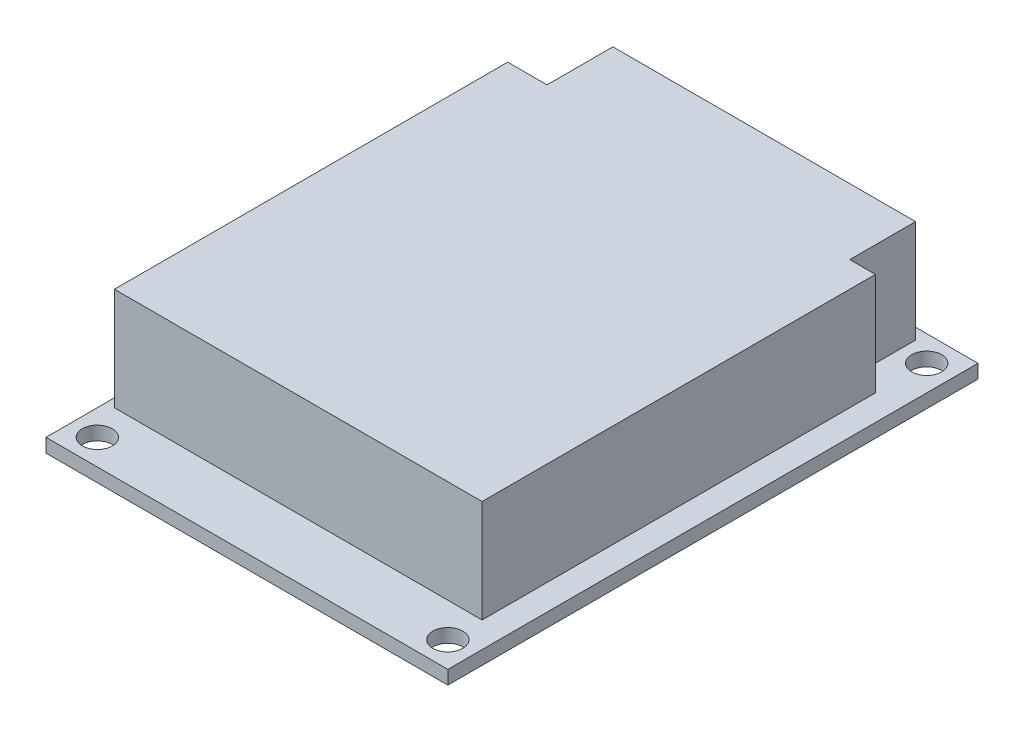
ISO-10303-21;
HEADER;
FILE_DESCRIPTION(('STEP AP214'),'2;1');
FILE_NAME('part.step','',(''),(''),'','','');
FILE_SCHEMA(('AUTOMOTIVE_DESIGN { 1 0 10303 214 1 1 1 1 }'));
ENDSEC;
DATA;
#1=APPLICATION_CONTEXT('core data for automotive mechanical design processes');
#2=APPLICATION_PROTOCOL_DEFINITION('international standard','automotive_design',2000,#1);
#3=PRODUCT_CONTEXT('',#1,'mechanical');
#4=PRODUCT('Part','Part','',(#3));
#5=PRODUCT_RELATED_PRODUCT_CATEGORY('part','',(#4));
#6=PRODUCT_DEFINITION_FORMATION('','',#4);
#7=PRODUCT_DEFINITION_CONTEXT('part definition',#1,'design');
#8=PRODUCT_DEFINITION('design','',#6,#7);
#9=PRODUCT_DEFINITION_SHAPE('','',#8);
#10=(LENGTH_UNIT() NAMED_UNIT(*) SI_UNIT(.MILLI.,.METRE.));
#11=(NAMED_UNIT(*) PLANE_ANGLE_UNIT() SI_UNIT($,.RADIAN.));
#12=(NAMED_UNIT(*) SI_UNIT($,.STERADIAN.) SOLID_ANGLE_UNIT());
#13=UNCERTAINTY_MEASURE_WITH_UNIT(LENGTH_MEASURE(1.E-05),#10,'distance_accuracy_value','');
#14=(GEOMETRIC_REPRESENTATION_CONTEXT(3) GLOBAL_UNCERTAINTY_ASSIGNED_CONTEXT((#13)) GLOBAL_UNIT_ASSIGNED_CONTEXT((#10,
#11,#12)) REPRESENTATION_CONTEXT('',''));
#15=CARTESIAN_POINT('',(0.,0.,0.));
#16=DIRECTION('',(0.,0.,1.));
#17=DIRECTION('',(1.,0.,0.));
#18=AXIS2_PLACEMENT_3D('',#15,#16,#17);
#19=CARTESIAN_POINT('',(0.,0.,0.));
#20=DIRECTION('',(0.,-1.,0.));
#21=DIRECTION('',(0.,0.,-1.));
#22=AXIS2_PLACEMENT_3D('',#19,#20,#21);
#23=PLANE('',#22);
#24=DIRECTION('',(0.,0.,-1.));
#25=VECTOR('',#24,1.);
#26=CARTESIAN_POINT('',(23.5,0.,31.));
#27=LINE('',#26,#25);
#28=CARTESIAN_POINT('',(23.5,0.,31.));
#29=VERTEX_POINT('',#28);
#30=CARTESIAN_POINT('',(23.5,0.,-31.));
#31=VERTEX_POINT('',#30);
#32=EDGE_CURVE('E177',#29,#31,#27,.T.);
#33=ORIENTED_EDGE('',*,*,#32,.T.);
#34=DIRECTION('',(-1.,0.,0.));
#35=VECTOR('',#34,1.);
#36=CARTESIAN_POINT('',(-23.5,0.,-31.));
#37=LINE('',#36,#35);
#38=CARTESIAN_POINT('',(-23.5,0.,-31.));
#39=VERTEX_POINT('',#38);
#40=EDGE_CURVE('E195',#31,#39,#37,.T.);
#41=ORIENTED_EDGE('',*,*,#40,.T.);
#42=DIRECTION('',(0.,0.,1.));
#43=VECTOR('',#42,1.);
#44=CARTESIAN_POINT('',(-23.5,0.,31.));
#45=LINE('',#44,#43);
#46=CARTESIAN_POINT('',(-23.5,0.,31.));
#47=VERTEX_POINT('',#46);
#48=EDGE_CURVE('E198',#39,#47,#45,.T.);
#49=ORIENTED_EDGE('',*,*,#48,.T.);
#50=DIRECTION('',(1.,0.,0.));
#51=VECTOR('',#50,1.);
#52=CARTESIAN_POINT('',(-23.5,0.,31.));
#53=LINE('',#52,#51);
#54=EDGE_CURVE('E184',#47,#29,#53,.T.);
#55=ORIENTED_EDGE('',*,*,#54,.T.);
#56=EDGE_LOOP('',(#33,#41,#49,#55));
#57=FACE_BOUND('',#56,.T.);
#58=CARTESIAN_POINT('',(-20.5,0.,28.));
#59=DIRECTION('',(0.,1.,0.));
#60=DIRECTION('',(0.,0.,1.));
#61=AXIS2_PLACEMENT_3D('',#58,#59,#60);
#62=CIRCLE('',#61,1.75);
#63=CARTESIAN_POINT('',(-20.5,0.,29.75));
#64=VERTEX_POINT('',#63);
#65=EDGE_CURVE('E171',#64,#64,#62,.T.);
#66=ORIENTED_EDGE('',*,*,#65,.F.);
#67=EDGE_LOOP('',(#66));
#68=FACE_BOUND('',#67,.T.);
#69=CARTESIAN_POINT('',(20.5,0.,28.));
#70=DIRECTION('',(0.,1.,0.));
#71=DIRECTION('',(0.,0.,1.));
#72=AXIS2_PLACEMENT_3D('',#69,#70,#71);
#73=CIRCLE('',#72,1.75);
#74=CARTESIAN_POINT('',(20.5,0.,29.75));
#75=VERTEX_POINT('',#74);
#76=EDGE_CURVE('E165',#75,#75,#73,.T.);
#77=ORIENTED_EDGE('',*,*,#76,.F.);
#78=EDGE_LOOP('',(#77));
#79=FACE_BOUND('',#78,.T.);
#80=CARTESIAN_POINT('',(20.5,0.,-28.));
#81=DIRECTION('',(0.,1.,0.));
#82=DIRECTION('',(0.,0.,1.));
#83=AXIS2_PLACEMENT_3D('',#80,#81,#82);
#84=CIRCLE('',#83,1.75);
#85=CARTESIAN_POINT('',(20.5,0.,-26.25));
#86=VERTEX_POINT('',#85);
#87=EDGE_CURVE('E160',#86,#86,#84,.T.);
#88=ORIENTED_EDGE('',*,*,#87,.F.);
#89=EDGE_LOOP('',(#88));
#90=FACE_BOUND('',#89,.T.);
#91=CARTESIAN_POINT('',(-20.5,0.,-28.));
#92=DIRECTION('',(0.,1.,0.));
#93=DIRECTION('',(0.,0.,1.));
#94=AXIS2_PLACEMENT_3D('',#91,#92,#93);
#95=CIRCLE('',#94,1.75);
#96=CARTESIAN_POINT('',(-20.5,0.,-26.25));
#97=VERTEX_POINT('',#96);
#98=EDGE_CURVE('E150',#97,#97,#95,.T.);
#99=ORIENTED_EDGE('',*,*,#98,.F.);
#100=EDGE_LOOP('',(#99));
#101=FACE_BOUND('',#100,.T.);
#102=DIRECTION('',(0.,0.,1.));
#103=VECTOR('',#102,1.);
#104=CARTESIAN_POINT('',(-22.5,0.,-22.));
#105=LINE('',#104,#103);
#106=CARTESIAN_POINT('',(-22.5,0.,-22.));
#107=VERTEX_POINT('',#106);
#108=CARTESIAN_POINT('',(-22.5,0.,24.));
#109=VERTEX_POINT('',#108);
#110=EDGE_CURVE('E149',#107,#109,#105,.T.);
#111=ORIENTED_EDGE('',*,*,#110,.F.);
#112=DIRECTION('',(-1.,0.,0.));
#113=VECTOR('',#112,1.);
#114=CARTESIAN_POINT('',(-22.5,0.,-22.));
#115=LINE('',#114,#113);
#116=CARTESIAN_POINT('',(-17.9,0.,-22.));
#117=VERTEX_POINT('',#116);
#118=EDGE_CURVE('E146',#117,#107,#115,.T.);
#119=ORIENTED_EDGE('',*,*,#118,.F.);
#120=DIRECTION('',(0.,0.,1.));
#121=VECTOR('',#120,1.);
#122=CARTESIAN_POINT('',(-17.9,0.,-22.));
#123=LINE('',#122,#121);
#124=CARTESIAN_POINT('',(-17.9,0.,-29.7));
#125=VERTEX_POINT('',#124);
#126=EDGE_CURVE('E400',#125,#117,#123,.T.);
#127=ORIENTED_EDGE('',*,*,#126,.F.);
#128=DIRECTION('',(-1.,0.,0.));
#129=VECTOR('',#128,1.);
#130=CARTESIAN_POINT('',(-17.9,0.,-29.7));
#131=LINE('',#130,#129);
#132=CARTESIAN_POINT('',(17.5,0.,-29.7));
#133=VERTEX_POINT('',#132);
#134=EDGE_CURVE('E431',#133,#125,#131,.T.);
#135=ORIENTED_EDGE('',*,*,#134,.F.);
#136=DIRECTION('',(0.,0.,-1.));
#137=VECTOR('',#136,1.);
#138=CARTESIAN_POINT('',(17.5,0.,-22.));
#139=LINE('',#138,#137);
#140=CARTESIAN_POINT('',(17.5,0.,-22.));
#141=VERTEX_POINT('',#140);
#142=EDGE_CURVE('E424',#141,#133,#139,.T.);
#143=ORIENTED_EDGE('',*,*,#142,.F.);
#144=DIRECTION('',(-1.,0.,0.));
#145=VECTOR('',#144,1.);
#146=CARTESIAN_POINT('',(17.5,0.,-22.));
#147=LINE('',#146,#145);
#148=CARTESIAN_POINT('',(20.5,0.,-22.));
#149=VERTEX_POINT('',#148);
#150=EDGE_CURVE('E421',#149,#141,#147,.T.);
#151=ORIENTED_EDGE('',*,*,#150,.F.);
#152=DIRECTION('',(0.,0.,-1.));
#153=VECTOR('',#152,1.);
#154=CARTESIAN_POINT('',(20.5,0.,-22.));
#155=LINE('',#154,#153);
#156=CARTESIAN_POINT('',(20.5,0.,24.));
#157=VERTEX_POINT('',#156);
#158=EDGE_CURVE('E61',#157,#149,#155,.T.);
#159=ORIENTED_EDGE('',*,*,#158,.F.);
#160=DIRECTION('',(1.,0.,0.));
#161=VECTOR('',#160,1.);
#162=CARTESIAN_POINT('',(-22.5,0.,24.));
#163=LINE('',#162,#161);
#164=EDGE_CURVE('E56',#109,#157,#163,.T.);
#165=ORIENTED_EDGE('',*,*,#164,.F.);
#166=EDGE_LOOP('',(#111,#119,#127,#135,#143,#151,#159,#165));
#167=FACE_BOUND('',#166,.T.);
#168=ADVANCED_FACE('F39',(#57,#68,#79,#90,#101,#167),#23,.F.);
#169=CARTESIAN_POINT('',(23.5,-1.6,31.));
#170=DIRECTION('',(1.,0.,0.));
#171=DIRECTION('',(0.,0.,-1.));
#172=AXIS2_PLACEMENT_3D('',#169,#170,#171);
#173=PLANE('',#172);
#174=ORIENTED_EDGE('',*,*,#32,.F.);
#175=DIRECTION('',(0.,1.,0.));
#176=VECTOR('',#175,1.);
#177=CARTESIAN_POINT('',(23.5,-1.6,31.));
#178=LINE('',#177,#176);
#179=CARTESIAN_POINT('',(23.5,-1.6,31.));
#180=VERTEX_POINT('',#179);
#181=EDGE_CURVE('E11',#180,#29,#178,.T.);
#182=ORIENTED_EDGE('',*,*,#181,.F.);
#183=DIRECTION('',(0.,0.,-1.));
#184=VECTOR('',#183,1.);
#185=CARTESIAN_POINT('',(23.5,-1.6,31.));
#186=LINE('',#185,#184);
#187=CARTESIAN_POINT('',(23.5,-1.6,-31.));
#188=VERTEX_POINT('',#187);
#189=EDGE_CURVE('E180',#180,#188,#186,.T.);
#190=ORIENTED_EDGE('',*,*,#189,.T.);
#191=DIRECTION('',(0.,1.,0.));
#192=VECTOR('',#191,1.);
#193=CARTESIAN_POINT('',(23.5,-1.6,-31.));
#194=LINE('',#193,#192);
#195=EDGE_CURVE('E43',#188,#31,#194,.T.);
#196=ORIENTED_EDGE('',*,*,#195,.T.);
#197=EDGE_LOOP('',(#174,#182,#190,#196));
#198=FACE_BOUND('',#197,.T.);
#199=ADVANCED_FACE('F41',(#198),#173,.T.);
#200=CARTESIAN_POINT('',(-23.5,-1.6,31.));
#201=DIRECTION('',(0.,0.,1.));
#202=DIRECTION('',(1.,0.,0.));
#203=AXIS2_PLACEMENT_3D('',#200,#201,#202);
#204=PLANE('',#203);
#205=ORIENTED_EDGE('',*,*,#54,.F.);
#206=DIRECTION('',(0.,1.,0.));
#207=VECTOR('',#206,1.);
#208=CARTESIAN_POINT('',(-23.5,-1.6,31.));
#209=LINE('',#208,#207);
#210=CARTESIAN_POINT('',(-23.5,-1.6,31.));
#211=VERTEX_POINT('',#210);
#212=EDGE_CURVE('E48',#211,#47,#209,.T.);
#213=ORIENTED_EDGE('',*,*,#212,.F.);
#214=DIRECTION('',(1.,0.,0.));
#215=VECTOR('',#214,1.);
#216=CARTESIAN_POINT('',(-23.5,-1.6,31.));
#217=LINE('',#216,#215);
#218=EDGE_CURVE('E190',#211,#180,#217,.T.);
#219=ORIENTED_EDGE('',*,*,#218,.T.);
#220=ORIENTED_EDGE('',*,*,#181,.T.);
#221=EDGE_LOOP('',(#205,#213,#219,#220));
#222=FACE_BOUND('',#221,.T.);
#223=ADVANCED_FACE('F216',(#222),#204,.T.);
#224=CARTESIAN_POINT('',(-23.5,-1.6,31.));
#225=DIRECTION('',(-1.,0.,0.));
#226=DIRECTION('',(0.,0.,1.));
#227=AXIS2_PLACEMENT_3D('',#224,#225,#226);
#228=PLANE('',#227);
#229=ORIENTED_EDGE('',*,*,#48,.F.);
#230=DIRECTION('',(0.,1.,0.));
#231=VECTOR('',#230,1.);
#232=CARTESIAN_POINT('',(-23.5,-1.6,-31.));
#233=LINE('',#232,#231);
#234=CARTESIAN_POINT('',(-23.5,-1.6,-31.));
#235=VERTEX_POINT('',#234);
#236=EDGE_CURVE('E203',#235,#39,#233,.T.);
#237=ORIENTED_EDGE('',*,*,#236,.F.);
#238=DIRECTION('',(0.,0.,1.));
#239=VECTOR('',#238,1.);
#240=CARTESIAN_POINT('',(-23.5,-1.6,31.));
#241=LINE('',#240,#239);
#242=EDGE_CURVE('E187',#235,#211,#241,.T.);
#243=ORIENTED_EDGE('',*,*,#242,.T.);
#244=ORIENTED_EDGE('',*,*,#212,.T.);
#245=EDGE_LOOP('',(#229,#237,#243,#244));
#246=FACE_BOUND('',#245,.T.);
#247=ADVANCED_FACE('F222',(#246),#228,.T.);
#248=CARTESIAN_POINT('',(-23.5,-1.6,-31.));
#249=DIRECTION('',(0.,0.,-1.));
#250=DIRECTION('',(-1.,0.,0.));
#251=AXIS2_PLACEMENT_3D('',#248,#249,#250);
#252=PLANE('',#251);
#253=ORIENTED_EDGE('',*,*,#40,.F.);
#254=ORIENTED_EDGE('',*,*,#195,.F.);
#255=DIRECTION('',(-1.,0.,0.));
#256=VECTOR('',#255,1.);
#257=CARTESIAN_POINT('',(-23.5,-1.6,-31.));
#258=LINE('',#257,#256);
#259=EDGE_CURVE('E183',#188,#235,#258,.T.);
#260=ORIENTED_EDGE('',*,*,#259,.T.);
#261=ORIENTED_EDGE('',*,*,#236,.T.);
#262=EDGE_LOOP('',(#253,#254,#260,#261));
#263=FACE_BOUND('',#262,.T.);
#264=ADVANCED_FACE('F211',(#263),#252,.T.);
#265=CARTESIAN_POINT('',(0.,-1.6,0.));
#266=DIRECTION('',(0.,-1.,0.));
#267=DIRECTION('',(0.,0.,-1.));
#268=AXIS2_PLACEMENT_3D('',#265,#266,#267);
#269=PLANE('',#268);
#270=CARTESIAN_POINT('',(-20.5,-1.6,-28.));
#271=DIRECTION('',(0.,1.,0.));
#272=DIRECTION('',(0.,0.,1.));
#273=AXIS2_PLACEMENT_3D('',#270,#271,#272);
#274=CIRCLE('',#273,1.75);
#275=CARTESIAN_POINT('',(-20.5,-1.6,-26.25));
#276=VERTEX_POINT('',#275);
#277=EDGE_CURVE('E153',#276,#276,#274,.T.);
#278=ORIENTED_EDGE('',*,*,#277,.T.);
#279=EDGE_LOOP('',(#278));
#280=FACE_BOUND('',#279,.T.);
#281=CARTESIAN_POINT('',(20.5,-1.6,-28.));
#282=DIRECTION('',(0.,1.,0.));
#283=DIRECTION('',(0.,0.,1.));
#284=AXIS2_PLACEMENT_3D('',#281,#282,#283);
#285=CIRCLE('',#284,1.75);
#286=CARTESIAN_POINT('',(20.5,-1.6,-26.25));
#287=VERTEX_POINT('',#286);
#288=EDGE_CURVE('E162',#287,#287,#285,.T.);
#289=ORIENTED_EDGE('',*,*,#288,.T.);
#290=EDGE_LOOP('',(#289));
#291=FACE_BOUND('',#290,.T.);
#292=CARTESIAN_POINT('',(20.5,-1.6,28.));
#293=DIRECTION('',(0.,1.,0.));
#294=DIRECTION('',(0.,0.,1.));
#295=AXIS2_PLACEMENT_3D('',#292,#293,#294);
#296=CIRCLE('',#295,1.75);
#297=CARTESIAN_POINT('',(20.5,-1.6,29.75));
#298=VERTEX_POINT('',#297);
#299=EDGE_CURVE('E168',#298,#298,#296,.T.);
#300=ORIENTED_EDGE('',*,*,#299,.T.);
#301=EDGE_LOOP('',(#300));
#302=FACE_BOUND('',#301,.T.);
#303=CARTESIAN_POINT('',(-20.5,-1.6,28.));
#304=DIRECTION('',(0.,1.,0.));
#305=DIRECTION('',(0.,0.,1.));
#306=AXIS2_PLACEMENT_3D('',#303,#304,#305);
#307=CIRCLE('',#306,1.75);
#308=CARTESIAN_POINT('',(-20.5,-1.6,29.75));
#309=VERTEX_POINT('',#308);
#310=EDGE_CURVE('E174',#309,#309,#307,.T.);
#311=ORIENTED_EDGE('',*,*,#310,.T.);
#312=EDGE_LOOP('',(#311));
#313=FACE_BOUND('',#312,.T.);
#314=ORIENTED_EDGE('',*,*,#189,.F.);
#315=ORIENTED_EDGE('',*,*,#218,.F.);
#316=ORIENTED_EDGE('',*,*,#242,.F.);
#317=ORIENTED_EDGE('',*,*,#259,.F.);
#318=EDGE_LOOP('',(#314,#315,#316,#317));
#319=FACE_BOUND('',#318,.T.);
#320=ADVANCED_FACE('F219',(#280,#291,#302,#313,#319),#269,.T.);
#321=CARTESIAN_POINT('',(-20.5,-1.6,28.));
#322=DIRECTION('',(0.,1.,0.));
#323=DIRECTION('',(0.,0.,1.));
#324=AXIS2_PLACEMENT_3D('',#321,#322,#323);
#325=CYLINDRICAL_SURFACE('',#324,1.75);
#326=ORIENTED_EDGE('',*,*,#310,.F.);
#327=EDGE_LOOP('',(#326));
#328=FACE_BOUND('',#327,.T.);
#329=ORIENTED_EDGE('',*,*,#65,.T.);
#330=EDGE_LOOP('',(#329));
#331=FACE_BOUND('',#330,.T.);
#332=ADVANCED_FACE('F240',(#328,#331),#325,.F.);
#333=CARTESIAN_POINT('',(20.5,-1.6,28.));
#334=DIRECTION('',(0.,1.,0.));
#335=DIRECTION('',(0.,0.,1.));
#336=AXIS2_PLACEMENT_3D('',#333,#334,#335);
#337=CYLINDRICAL_SURFACE('',#336,1.75);
#338=ORIENTED_EDGE('',*,*,#299,.F.);
#339=EDGE_LOOP('',(#338));
#340=FACE_BOUND('',#339,.T.);
#341=ORIENTED_EDGE('',*,*,#76,.T.);
#342=EDGE_LOOP('',(#341));
#343=FACE_BOUND('',#342,.T.);
#344=ADVANCED_FACE('F244',(#340,#343),#337,.F.);
#345=CARTESIAN_POINT('',(20.5,-1.6,-28.));
#346=DIRECTION('',(0.,1.,0.));
#347=DIRECTION('',(0.,0.,1.));
#348=AXIS2_PLACEMENT_3D('',#345,#346,#347);
#349=CYLINDRICAL_SURFACE('',#348,1.75);
#350=ORIENTED_EDGE('',*,*,#288,.F.);
#351=EDGE_LOOP('',(#350));
#352=FACE_BOUND('',#351,.T.);
#353=ORIENTED_EDGE('',*,*,#87,.T.);
#354=EDGE_LOOP('',(#353));
#355=FACE_BOUND('',#354,.T.);
#356=ADVANCED_FACE('F248',(#352,#355),#349,.F.);
#357=CARTESIAN_POINT('',(-20.5,-1.6,-28.));
#358=DIRECTION('',(0.,1.,0.));
#359=DIRECTION('',(0.,0.,1.));
#360=AXIS2_PLACEMENT_3D('',#357,#358,#359);
#361=CYLINDRICAL_SURFACE('',#360,1.75);
#362=ORIENTED_EDGE('',*,*,#277,.F.);
#363=EDGE_LOOP('',(#362));
#364=FACE_BOUND('',#363,.T.);
#365=ORIENTED_EDGE('',*,*,#98,.T.);
#366=EDGE_LOOP('',(#365));
#367=FACE_BOUND('',#366,.T.);
#368=ADVANCED_FACE('F252',(#364,#367),#361,.F.);
#369=CARTESIAN_POINT('',(-22.5,12.,-22.));
#370=DIRECTION('',(1.,0.,0.));
#371=DIRECTION('',(0.,0.,-1.));
#372=AXIS2_PLACEMENT_3D('',#369,#370,#371);
#373=PLANE('',#372);
#374=ORIENTED_EDGE('',*,*,#110,.T.);
#375=DIRECTION('',(0.,-1.,0.));
#376=VECTOR('',#375,1.);
#377=CARTESIAN_POINT('',(-22.5,12.,24.));
#378=LINE('',#377,#376);
#379=CARTESIAN_POINT('',(-22.5,12.,24.));
#380=VERTEX_POINT('',#379);
#381=EDGE_CURVE('E130',#380,#109,#378,.T.);
#382=ORIENTED_EDGE('',*,*,#381,.F.);
#383=DIRECTION('',(0.,0.,1.));
#384=VECTOR('',#383,1.);
#385=CARTESIAN_POINT('',(-22.5,12.,-22.));
#386=LINE('',#385,#384);
#387=CARTESIAN_POINT('',(-22.5,12.,-22.));
#388=VERTEX_POINT('',#387);
#389=EDGE_CURVE('E137',#388,#380,#386,.T.);
#390=ORIENTED_EDGE('',*,*,#389,.F.);
#391=DIRECTION('',(0.,-1.,0.));
#392=VECTOR('',#391,1.);
#393=CARTESIAN_POINT('',(-22.5,12.,-22.));
#394=LINE('',#393,#392);
#395=EDGE_CURVE('E396',#388,#107,#394,.T.);
#396=ORIENTED_EDGE('',*,*,#395,.T.);
#397=EDGE_LOOP('',(#374,#382,#390,#396));
#398=FACE_BOUND('',#397,.T.);
#399=ADVANCED_FACE('F148',(#398),#373,.F.);
#400=CARTESIAN_POINT('',(-22.5,12.,24.));
#401=DIRECTION('',(0.,0.,-1.));
#402=DIRECTION('',(-1.,0.,0.));
#403=AXIS2_PLACEMENT_3D('',#400,#401,#402);
#404=PLANE('',#403);
#405=ORIENTED_EDGE('',*,*,#164,.T.);
#406=DIRECTION('',(0.,-1.,0.));
#407=VECTOR('',#406,1.);
#408=CARTESIAN_POINT('',(20.5,12.,24.));
#409=LINE('',#408,#407);
#410=CARTESIAN_POINT('',(20.5,12.,24.));
#411=VERTEX_POINT('',#410);
#412=EDGE_CURVE('E133',#411,#157,#409,.T.);
#413=ORIENTED_EDGE('',*,*,#412,.F.);
#414=DIRECTION('',(1.,0.,0.));
#415=VECTOR('',#414,1.);
#416=CARTESIAN_POINT('',(-22.5,12.,24.));
#417=LINE('',#416,#415);
#418=EDGE_CURVE('E126',#380,#411,#417,.T.);
#419=ORIENTED_EDGE('',*,*,#418,.F.);
#420=ORIENTED_EDGE('',*,*,#381,.T.);
#421=EDGE_LOOP('',(#405,#413,#419,#420));
#422=FACE_BOUND('',#421,.T.);
#423=ADVANCED_FACE('F128',(#422),#404,.F.);
#424=CARTESIAN_POINT('',(20.5,12.,-22.));
#425=DIRECTION('',(-1.,0.,0.));
#426=DIRECTION('',(0.,0.,1.));
#427=AXIS2_PLACEMENT_3D('',#424,#425,#426);
#428=PLANE('',#427);
#429=ORIENTED_EDGE('',*,*,#158,.T.);
#430=DIRECTION('',(0.,-1.,0.));
#431=VECTOR('',#430,1.);
#432=CARTESIAN_POINT('',(20.5,12.,-22.));
#433=LINE('',#432,#431);
#434=CARTESIAN_POINT('',(20.5,12.,-22.));
#435=VERTEX_POINT('',#434);
#436=EDGE_CURVE('E155',#435,#149,#433,.T.);
#437=ORIENTED_EDGE('',*,*,#436,.F.);
#438=DIRECTION('',(0.,0.,-1.));
#439=VECTOR('',#438,1.);
#440=CARTESIAN_POINT('',(20.5,12.,-22.));
#441=LINE('',#440,#439);
#442=EDGE_CURVE('E136',#411,#435,#441,.T.);
#443=ORIENTED_EDGE('',*,*,#442,.F.);
#444=ORIENTED_EDGE('',*,*,#412,.T.);
#445=EDGE_LOOP('',(#429,#437,#443,#444));
#446=FACE_BOUND('',#445,.T.);
#447=ADVANCED_FACE('F259',(#446),#428,.F.);
#448=CARTESIAN_POINT('',(17.5,12.,-22.));
#449=DIRECTION('',(0.,0.,1.));
#450=DIRECTION('',(1.,0.,0.));
#451=AXIS2_PLACEMENT_3D('',#448,#449,#450);
#452=PLANE('',#451);
#453=ORIENTED_EDGE('',*,*,#150,.T.);
#454=DIRECTION('',(0.,-1.,0.));
#455=VECTOR('',#454,1.);
#456=CARTESIAN_POINT('',(17.5,12.,-22.));
#457=LINE('',#456,#455);
#458=CARTESIAN_POINT('',(17.5,12.,-22.));
#459=VERTEX_POINT('',#458);
#460=EDGE_CURVE('E414',#459,#141,#457,.T.);
#461=ORIENTED_EDGE('',*,*,#460,.F.);
#462=DIRECTION('',(-1.,0.,0.));
#463=VECTOR('',#462,1.);
#464=CARTESIAN_POINT('',(17.5,12.,-22.));
#465=LINE('',#464,#463);
#466=EDGE_CURVE('E422',#435,#459,#465,.T.);
#467=ORIENTED_EDGE('',*,*,#466,.F.);
#468=ORIENTED_EDGE('',*,*,#436,.T.);
#469=EDGE_LOOP('',(#453,#461,#467,#468));
#470=FACE_BOUND('',#469,.T.);
#471=ADVANCED_FACE('F262',(#470),#452,.F.);
#472=CARTESIAN_POINT('',(17.5,12.,-22.));
#473=DIRECTION('',(-1.,0.,0.));
#474=DIRECTION('',(0.,0.,1.));
#475=AXIS2_PLACEMENT_3D('',#472,#473,#474);
#476=PLANE('',#475);
#477=ORIENTED_EDGE('',*,*,#142,.T.);
#478=DIRECTION('',(0.,-1.,0.));
#479=VECTOR('',#478,1.);
#480=CARTESIAN_POINT('',(17.5,12.,-29.7));
#481=LINE('',#480,#479);
#482=CARTESIAN_POINT('',(17.5,12.,-29.7));
#483=VERTEX_POINT('',#482);
#484=EDGE_CURVE('E411',#483,#133,#481,.T.);
#485=ORIENTED_EDGE('',*,*,#484,.F.);
#486=DIRECTION('',(0.,0.,-1.));
#487=VECTOR('',#486,1.);
#488=CARTESIAN_POINT('',(17.5,12.,-22.));
#489=LINE('',#488,#487);
#490=EDGE_CURVE('E439',#459,#483,#489,.T.);
#491=ORIENTED_EDGE('',*,*,#490,.F.);
#492=ORIENTED_EDGE('',*,*,#460,.T.);
#493=EDGE_LOOP('',(#477,#485,#491,#492));
#494=FACE_BOUND('',#493,.T.);
#495=ADVANCED_FACE('F266',(#494),#476,.F.);
#496=CARTESIAN_POINT('',(-17.9,12.,-29.7));
#497=DIRECTION('',(0.,0.,1.));
#498=DIRECTION('',(1.,0.,0.));
#499=AXIS2_PLACEMENT_3D('',#496,#497,#498);
#500=PLANE('',#499);
#501=ORIENTED_EDGE('',*,*,#134,.T.);
#502=DIRECTION('',(0.,-1.,0.));
#503=VECTOR('',#502,1.);
#504=CARTESIAN_POINT('',(-17.9,12.,-29.7));
#505=LINE('',#504,#503);
#506=CARTESIAN_POINT('',(-17.9,12.,-29.7));
#507=VERTEX_POINT('',#506);
#508=EDGE_CURVE('E403',#507,#125,#505,.T.);
#509=ORIENTED_EDGE('',*,*,#508,.F.);
#510=DIRECTION('',(-1.,0.,0.));
#511=VECTOR('',#510,1.);
#512=CARTESIAN_POINT('',(-17.9,12.,-29.7));
#513=LINE('',#512,#511);
#514=EDGE_CURVE('E437',#483,#507,#513,.T.);
#515=ORIENTED_EDGE('',*,*,#514,.F.);
#516=ORIENTED_EDGE('',*,*,#484,.T.);
#517=EDGE_LOOP('',(#501,#509,#515,#516));
#518=FACE_BOUND('',#517,.T.);
#519=ADVANCED_FACE('F270',(#518),#500,.F.);
#520=CARTESIAN_POINT('',(-17.9,12.,-22.));
#521=DIRECTION('',(1.,0.,0.));
#522=DIRECTION('',(0.,0.,-1.));
#523=AXIS2_PLACEMENT_3D('',#520,#521,#522);
#524=PLANE('',#523);
#525=ORIENTED_EDGE('',*,*,#126,.T.);
#526=DIRECTION('',(0.,-1.,0.));
#527=VECTOR('',#526,1.);
#528=CARTESIAN_POINT('',(-17.9,12.,-22.));
#529=LINE('',#528,#527);
#530=CARTESIAN_POINT('',(-17.9,12.,-22.));
#531=VERTEX_POINT('',#530);
#532=EDGE_CURVE('E398',#531,#117,#529,.T.);
#533=ORIENTED_EDGE('',*,*,#532,.F.);
#534=DIRECTION('',(0.,0.,1.));
#535=VECTOR('',#534,1.);
#536=CARTESIAN_POINT('',(-17.9,12.,-22.));
#537=LINE('',#536,#535);
#538=EDGE_CURVE('E405',#507,#531,#537,.T.);
#539=ORIENTED_EDGE('',*,*,#538,.F.);
#540=ORIENTED_EDGE('',*,*,#508,.T.);
#541=EDGE_LOOP('',(#525,#533,#539,#540));
#542=FACE_BOUND('',#541,.T.);
#543=ADVANCED_FACE('F274',(#542),#524,.F.);
#544=CARTESIAN_POINT('',(-22.5,12.,-22.));
#545=DIRECTION('',(0.,0.,1.));
#546=DIRECTION('',(1.,0.,0.));
#547=AXIS2_PLACEMENT_3D('',#544,#545,#546);
#548=PLANE('',#547);
#549=ORIENTED_EDGE('',*,*,#118,.T.);
#550=ORIENTED_EDGE('',*,*,#395,.F.);
#551=DIRECTION('',(-1.,0.,0.));
#552=VECTOR('',#551,1.);
#553=CARTESIAN_POINT('',(-22.5,12.,-22.));
#554=LINE('',#553,#552);
#555=EDGE_CURVE('E142',#531,#388,#554,.T.);
#556=ORIENTED_EDGE('',*,*,#555,.F.);
#557=ORIENTED_EDGE('',*,*,#532,.T.);
#558=EDGE_LOOP('',(#549,#550,#556,#557));
#559=FACE_BOUND('',#558,.T.);
#560=ADVANCED_FACE('F278',(#559),#548,.F.);
#561=CARTESIAN_POINT('',(0.,12.,0.));
#562=DIRECTION('',(0.,1.,0.));
#563=DIRECTION('',(0.,0.,1.));
#564=AXIS2_PLACEMENT_3D('',#561,#562,#563);
#565=PLANE('',#564);
#566=ORIENTED_EDGE('',*,*,#389,.T.);
#567=ORIENTED_EDGE('',*,*,#418,.T.);
#568=ORIENTED_EDGE('',*,*,#442,.T.);
#569=ORIENTED_EDGE('',*,*,#466,.T.);
#570=ORIENTED_EDGE('',*,*,#490,.T.);
#571=ORIENTED_EDGE('',*,*,#514,.T.);
#572=ORIENTED_EDGE('',*,*,#538,.T.);
#573=ORIENTED_EDGE('',*,*,#555,.T.);
#574=EDGE_LOOP('',(#566,#567,#568,#569,#570,#571,#572,#573));
#575=FACE_BOUND('',#574,.T.);
#576=ADVANCED_FACE('F140',(#575),#565,.T.);
#577=CLOSED_SHELL('',(#168,#199,#223,#247,#264,#320,#332,#344,#356,#368,#399,#423,#447,#471,
#495,#519,#543,#560,#576));
#578=MANIFOLD_SOLID_BREP('B2',#577);
#579=ADVANCED_BREP_SHAPE_REPRESENTATION('',(#18,#578),#14);
#580=SHAPE_DEFINITION_REPRESENTATION(#9,#579);
ENDSEC;
END-ISO-10303-21;
